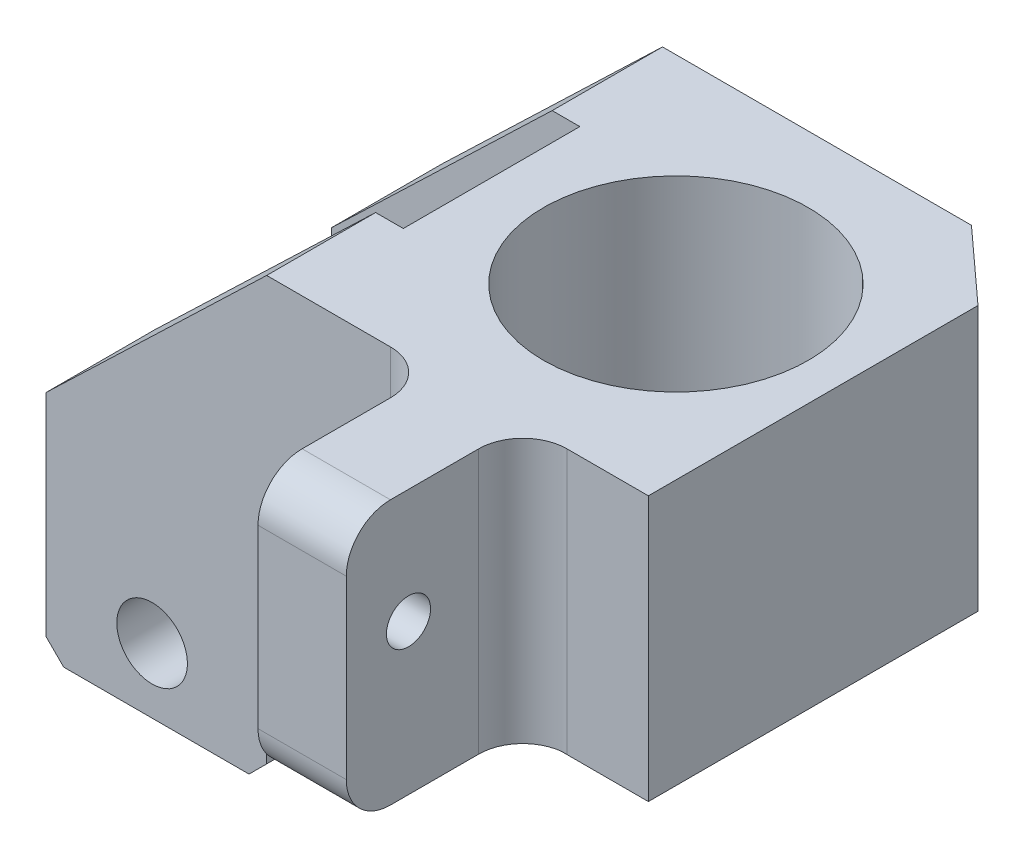
ISO-10303-21;
HEADER;
FILE_DESCRIPTION(('STEP AP214'),'2;1');
FILE_NAME('part.step','',(''),(''),'','','');
FILE_SCHEMA(('AUTOMOTIVE_DESIGN { 1 0 10303 214 1 1 1 1 }'));
ENDSEC;
DATA;
#1=APPLICATION_CONTEXT('core data for automotive mechanical design processes');
#2=APPLICATION_PROTOCOL_DEFINITION('international standard','automotive_design',2000,#1);
#3=PRODUCT_CONTEXT('',#1,'mechanical');
#4=PRODUCT('Part','Part','',(#3));
#5=PRODUCT_RELATED_PRODUCT_CATEGORY('part','',(#4));
#6=PRODUCT_DEFINITION_FORMATION('','',#4);
#7=PRODUCT_DEFINITION_CONTEXT('part definition',#1,'design');
#8=PRODUCT_DEFINITION('design','',#6,#7);
#9=PRODUCT_DEFINITION_SHAPE('','',#8);
#10=(LENGTH_UNIT() NAMED_UNIT(*) SI_UNIT(.MILLI.,.METRE.));
#11=(NAMED_UNIT(*) PLANE_ANGLE_UNIT() SI_UNIT($,.RADIAN.));
#12=(NAMED_UNIT(*) SI_UNIT($,.STERADIAN.) SOLID_ANGLE_UNIT());
#13=UNCERTAINTY_MEASURE_WITH_UNIT(LENGTH_MEASURE(1.E-05),#10,'distance_accuracy_value','');
#14=(GEOMETRIC_REPRESENTATION_CONTEXT(3) GLOBAL_UNCERTAINTY_ASSIGNED_CONTEXT((#13)) GLOBAL_UNIT_ASSIGNED_CONTEXT((#10,
#11,#12)) REPRESENTATION_CONTEXT('',''));
#15=CARTESIAN_POINT('',(0.,0.,0.));
#16=DIRECTION('',(0.,0.,1.));
#17=DIRECTION('',(1.,0.,0.));
#18=AXIS2_PLACEMENT_3D('',#15,#16,#17);
#19=CARTESIAN_POINT('',(-24.019063341913,30.,22.3427618367169));
#20=DIRECTION('',(0.,0.,-1.));
#21=DIRECTION('',(-1.,0.,0.));
#22=AXIS2_PLACEMENT_3D('',#19,#20,#21);
#23=PLANE('',#22);
#24=CARTESIAN_POINT('',(-37.0000000016137,-12.5783063820862,22.3427618367169));
#25=DIRECTION('',(0.,0.,-1.));
#26=DIRECTION('',(-1.,0.,0.));
#27=AXIS2_PLACEMENT_3D('',#24,#25,#26);
#28=CIRCLE('',#27,3.99999999676854);
#29=CARTESIAN_POINT('',(-40.9999999983823,-12.5783063820862,22.3427618367169));
#30=VERTEX_POINT('',#29);
#31=EDGE_CURVE('E233',#30,#30,#28,.T.);
#32=ORIENTED_EDGE('',*,*,#31,.T.);
#33=EDGE_LOOP('',(#32));
#34=FACE_BOUND('',#33,.T.);
#35=DIRECTION('',(1.,0.,0.));
#36=VECTOR('',#35,1.);
#37=CARTESIAN_POINT('',(5.,0.0426958795110487,22.3427618367169));
#38=LINE('',#37,#36);
#39=CARTESIAN_POINT('',(-10.,0.0426958795110487,22.3427618367169));
#40=VERTEX_POINT('',#39);
#41=CARTESIAN_POINT('',(10.,0.0426958795110487,22.3427618367169));
#42=VERTEX_POINT('',#41);
#43=EDGE_CURVE('E46',#40,#42,#38,.T.);
#44=ORIENTED_EDGE('',*,*,#43,.F.);
#45=DIRECTION('',(0.,-1.,0.));
#46=VECTOR('',#45,1.);
#47=CARTESIAN_POINT('',(-10.,30.,22.3427618367169));
#48=LINE('',#47,#46);
#49=CARTESIAN_POINT('',(-10.,30.,22.3427618367169));
#50=VERTEX_POINT('',#49);
#51=EDGE_CURVE('E474',#40,#50,#48,.F.);
#52=ORIENTED_EDGE('',*,*,#51,.T.);
#53=DIRECTION('',(1.,0.,0.));
#54=VECTOR('',#53,1.);
#55=CARTESIAN_POINT('',(-24.019063341913,30.,22.3427618367169));
#56=LINE('',#55,#54);
#57=CARTESIAN_POINT('',(-24.019063341913,30.,22.3427618367169));
#58=VERTEX_POINT('',#57);
#59=EDGE_CURVE('E336',#58,#50,#56,.T.);
#60=ORIENTED_EDGE('',*,*,#59,.F.);
#61=DIRECTION('',(0.721568425538812,0.692343128271986,0.));
#62=VECTOR('',#61,1.);
#63=CARTESIAN_POINT('',(-24.019063341913,30.,22.3427618367169));
#64=LINE('',#63,#62);
#65=CARTESIAN_POINT('',(-49.019063341913,6.01256153375207,22.3427618367169));
#66=VERTEX_POINT('',#65);
#67=EDGE_CURVE('E255',#66,#58,#64,.T.);
#68=ORIENTED_EDGE('',*,*,#67,.F.);
#69=DIRECTION('',(0.,1.,0.));
#70=VECTOR('',#69,1.);
#71=CARTESIAN_POINT('',(-49.019063341913,-19.9275306984768,22.3427618367169));
#72=LINE('',#71,#70);
#73=CARTESIAN_POINT('',(-49.019063341913,-17.9275306984768,22.3427618367169));
#74=VERTEX_POINT('',#73);
#75=EDGE_CURVE('E555',#74,#66,#72,.T.);
#76=ORIENTED_EDGE('',*,*,#75,.F.);
#77=DIRECTION('',(-0.707106781186545,0.70710678118655,0.));
#78=VECTOR('',#77,1.);
#79=CARTESIAN_POINT('',(-47.019063341913,-19.9275306984768,22.3427618367169));
#80=LINE('',#79,#78);
#81=CARTESIAN_POINT('',(-47.019063341913,-19.9275306984768,22.3427618367169));
#82=VERTEX_POINT('',#81);
#83=EDGE_CURVE('E419',#74,#82,#80,.F.);
#84=ORIENTED_EDGE('',*,*,#83,.T.);
#85=DIRECTION('',(-1.,0.,0.));
#86=VECTOR('',#85,1.);
#87=CARTESIAN_POINT('',(-49.019063341913,-19.9275306984768,22.3427618367169));
#88=LINE('',#87,#86);
#89=CARTESIAN_POINT('',(-26.019063341913,-19.9275306984768,22.3427618367169));
#90=VERTEX_POINT('',#89);
#91=EDGE_CURVE('E262',#90,#82,#88,.T.);
#92=ORIENTED_EDGE('',*,*,#91,.F.);
#93=DIRECTION('',(-0.70710678118655,-0.707106781186545,0.));
#94=VECTOR('',#93,1.);
#95=CARTESIAN_POINT('',(-24.019063341913,-17.9275306984768,22.3427618367169));
#96=LINE('',#95,#94);
#97=CARTESIAN_POINT('',(-24.019063341913,-17.9275306984768,22.3427618367169));
#98=VERTEX_POINT('',#97);
#99=EDGE_CURVE('E421',#90,#98,#96,.F.);
#100=ORIENTED_EDGE('',*,*,#99,.T.);
#101=DIRECTION('',(0.,-1.,0.));
#102=VECTOR('',#101,1.);
#103=CARTESIAN_POINT('',(-24.019063341913,-19.9275306984768,22.3427618367169));
#104=LINE('',#103,#102);
#105=CARTESIAN_POINT('',(-24.019063341913,-5.,22.3427618367169));
#106=VERTEX_POINT('',#105);
#107=EDGE_CURVE('E258',#106,#98,#104,.T.);
#108=ORIENTED_EDGE('',*,*,#107,.F.);
#109=CARTESIAN_POINT('',(-19.0190633419129,-5.,22.3427618367169));
#110=DIRECTION('',(0.,0.,-1.));
#111=DIRECTION('',(-1.,0.,0.));
#112=AXIS2_PLACEMENT_3D('',#109,#110,#111);
#113=CIRCLE('',#112,5.);
#114=CARTESIAN_POINT('',(-19.0190633419129,0.,22.3427618367169));
#115=VERTEX_POINT('',#114);
#116=EDGE_CURVE('E592',#106,#115,#113,.T.);
#117=ORIENTED_EDGE('',*,*,#116,.T.);
#118=DIRECTION('',(1.,0.,0.));
#119=VECTOR('',#118,1.);
#120=CARTESIAN_POINT('',(-24.019063341913,0.,22.3427618367169));
#121=LINE('',#120,#119);
#122=CARTESIAN_POINT('',(19.2234627300087,0.,22.3427618367169));
#123=VERTEX_POINT('',#122);
#124=EDGE_CURVE('E273',#115,#123,#121,.T.);
#125=ORIENTED_EDGE('',*,*,#124,.T.);
#126=DIRECTION('',(0.,-1.,0.));
#127=VECTOR('',#126,1.);
#128=CARTESIAN_POINT('',(19.2234627300087,30.,22.3427618367169));
#129=LINE('',#128,#127);
#130=CARTESIAN_POINT('',(19.2234627300087,30.,22.3427618367169));
#131=VERTEX_POINT('',#130);
#132=EDGE_CURVE('E340',#131,#123,#129,.T.);
#133=ORIENTED_EDGE('',*,*,#132,.F.);
#134=CARTESIAN_POINT('',(10.,30.,22.3427618367169));
#135=VERTEX_POINT('',#134);
#136=EDGE_CURVE('E327',#135,#131,#56,.T.);
#137=ORIENTED_EDGE('',*,*,#136,.F.);
#138=DIRECTION('',(0.,1.,0.));
#139=VECTOR('',#138,1.);
#140=CARTESIAN_POINT('',(10.,0.0426958795110488,22.3427618367169));
#141=LINE('',#140,#139);
#142=EDGE_CURVE('E468',#135,#42,#141,.F.);
#143=ORIENTED_EDGE('',*,*,#142,.T.);
#144=EDGE_LOOP('',(#44,#52,#60,#68,#76,#84,#92,#100,#108,#117,#125,#133,#137,#143));
#145=FACE_BOUND('',#144,.T.);
#146=ADVANCED_FACE('F31',(#34,#145),#23,.F.);
#147=CARTESIAN_POINT('',(-24.019063341913,30.,22.3427618367169));
#148=DIRECTION('',(-0.692343128271986,0.721568425538812,0.));
#149=DIRECTION('',(-0.721568425538812,-0.692343128271986,0.));
#150=AXIS2_PLACEMENT_3D('',#147,#148,#149);
#151=PLANE('',#150);
#152=DIRECTION('',(0.721568425538812,0.692343128271986,0.));
#153=VECTOR('',#152,1.);
#154=CARTESIAN_POINT('',(-24.019063341913,30.,10.));
#155=LINE('',#154,#153);
#156=CARTESIAN_POINT('',(-49.019063341913,6.01256153375207,10.));
#157=VERTEX_POINT('',#156);
#158=CARTESIAN_POINT('',(-24.019063341913,30.,10.));
#159=VERTEX_POINT('',#158);
#160=EDGE_CURVE('E252',#157,#159,#155,.T.);
#161=ORIENTED_EDGE('',*,*,#160,.F.);
#162=DIRECTION('',(0.,0.,-1.));
#163=VECTOR('',#162,1.);
#164=CARTESIAN_POINT('',(-49.019063341913,6.01256153375207,22.3427618367169));
#165=LINE('',#164,#163);
#166=EDGE_CURVE('E308',#66,#157,#165,.T.);
#167=ORIENTED_EDGE('',*,*,#166,.F.);
#168=ORIENTED_EDGE('',*,*,#67,.T.);
#169=DIRECTION('',(0.,0.,1.));
#170=VECTOR('',#169,1.);
#171=CARTESIAN_POINT('',(-24.019063341913,30.,-22.5));
#172=LINE('',#171,#170);
#173=EDGE_CURVE('E325',#159,#58,#172,.T.);
#174=ORIENTED_EDGE('',*,*,#173,.F.);
#175=EDGE_LOOP('',(#161,#167,#168,#174));
#176=FACE_BOUND('',#175,.T.);
#177=ADVANCED_FACE('F499',(#176),#151,.T.);
#178=CARTESIAN_POINT('',(-49.019063341913,-19.9275306984768,22.3427618367169));
#179=DIRECTION('',(-1.,0.,0.));
#180=DIRECTION('',(0.,0.,1.));
#181=AXIS2_PLACEMENT_3D('',#178,#179,#180);
#182=PLANE('',#181);
#183=DIRECTION('',(0.,1.,0.));
#184=VECTOR('',#183,1.);
#185=CARTESIAN_POINT('',(-49.019063341913,-19.9275306984768,10.));
#186=LINE('',#185,#184);
#187=CARTESIAN_POINT('',(-49.019063341913,-17.9275306984768,10.));
#188=VERTEX_POINT('',#187);
#189=EDGE_CURVE('E245',#188,#157,#186,.T.);
#190=ORIENTED_EDGE('',*,*,#189,.F.);
#191=DIRECTION('',(0.,0.,1.));
#192=VECTOR('',#191,1.);
#193=CARTESIAN_POINT('',(-49.019063341913,-17.9275306984768,22.3427618367169));
#194=LINE('',#193,#192);
#195=EDGE_CURVE('E341',#188,#74,#194,.T.);
#196=ORIENTED_EDGE('',*,*,#195,.T.);
#197=ORIENTED_EDGE('',*,*,#75,.T.);
#198=ORIENTED_EDGE('',*,*,#166,.T.);
#199=EDGE_LOOP('',(#190,#196,#197,#198));
#200=FACE_BOUND('',#199,.T.);
#201=ADVANCED_FACE('F505',(#200),#182,.T.);
#202=CARTESIAN_POINT('',(-49.019063341913,-19.9275306984768,22.3427618367169));
#203=DIRECTION('',(0.,-1.,0.));
#204=DIRECTION('',(0.,0.,-1.));
#205=AXIS2_PLACEMENT_3D('',#202,#203,#204);
#206=PLANE('',#205);
#207=DIRECTION('',(-1.,0.,0.));
#208=VECTOR('',#207,1.);
#209=CARTESIAN_POINT('',(-49.019063341913,-19.9275306984768,10.));
#210=LINE('',#209,#208);
#211=CARTESIAN_POINT('',(-26.019063341913,-19.9275306984768,10.));
#212=VERTEX_POINT('',#211);
#213=CARTESIAN_POINT('',(-47.019063341913,-19.9275306984768,10.));
#214=VERTEX_POINT('',#213);
#215=EDGE_CURVE('E241',#212,#214,#210,.T.);
#216=ORIENTED_EDGE('',*,*,#215,.F.);
#217=DIRECTION('',(0.,0.,1.));
#218=VECTOR('',#217,1.);
#219=CARTESIAN_POINT('',(-26.019063341913,-19.9275306984768,22.3427618367169));
#220=LINE('',#219,#218);
#221=EDGE_CURVE('E417',#212,#90,#220,.T.);
#222=ORIENTED_EDGE('',*,*,#221,.T.);
#223=ORIENTED_EDGE('',*,*,#91,.T.);
#224=DIRECTION('',(0.,0.,-1.));
#225=VECTOR('',#224,1.);
#226=CARTESIAN_POINT('',(-47.019063341913,-19.9275306984768,22.3427618367169));
#227=LINE('',#226,#225);
#228=EDGE_CURVE('E414',#82,#214,#227,.T.);
#229=ORIENTED_EDGE('',*,*,#228,.T.);
#230=EDGE_LOOP('',(#216,#222,#223,#229));
#231=FACE_BOUND('',#230,.T.);
#232=ADVANCED_FACE('F558',(#231),#206,.T.);
#233=CARTESIAN_POINT('',(-24.019063341913,-19.9275306984768,22.3427618367169));
#234=DIRECTION('',(1.,0.,0.));
#235=DIRECTION('',(0.,0.,-1.));
#236=AXIS2_PLACEMENT_3D('',#233,#234,#235);
#237=PLANE('',#236);
#238=ORIENTED_EDGE('',*,*,#107,.T.);
#239=DIRECTION('',(0.,0.,-1.));
#240=VECTOR('',#239,1.);
#241=CARTESIAN_POINT('',(-24.019063341913,-17.9275306984768,22.3427618367169));
#242=LINE('',#241,#240);
#243=CARTESIAN_POINT('',(-24.019063341913,-17.9275306984768,10.));
#244=VERTEX_POINT('',#243);
#245=EDGE_CURVE('E403',#98,#244,#242,.T.);
#246=ORIENTED_EDGE('',*,*,#245,.T.);
#247=DIRECTION('',(0.,-1.,0.));
#248=VECTOR('',#247,1.);
#249=CARTESIAN_POINT('',(-24.019063341913,-19.9275306984768,10.));
#250=LINE('',#249,#248);
#251=CARTESIAN_POINT('',(-24.019063341913,-5.,10.));
#252=VERTEX_POINT('',#251);
#253=EDGE_CURVE('E291',#252,#244,#250,.T.);
#254=ORIENTED_EDGE('',*,*,#253,.F.);
#255=DIRECTION('',(0.,0.,1.));
#256=VECTOR('',#255,1.);
#257=CARTESIAN_POINT('',(-24.019063341913,-5.,16.1713809183584));
#258=LINE('',#257,#256);
#259=EDGE_CURVE('E270',#252,#106,#258,.T.);
#260=ORIENTED_EDGE('',*,*,#259,.T.);
#261=EDGE_LOOP('',(#238,#246,#254,#260));
#262=FACE_BOUND('',#261,.T.);
#263=ADVANCED_FACE('F524',(#262),#237,.T.);
#264=CARTESIAN_POINT('',(19.2234627300087,30.,-14.9999999997707));
#265=DIRECTION('',(-1.,0.,0.));
#266=DIRECTION('',(0.,0.,1.));
#267=AXIS2_PLACEMENT_3D('',#264,#265,#266);
#268=PLANE('',#267);
#269=DIRECTION('',(0.,0.,-1.));
#270=VECTOR('',#269,1.);
#271=CARTESIAN_POINT('',(19.2234627300087,0.,-14.9999999997707));
#272=LINE('',#271,#270);
#273=CARTESIAN_POINT('',(19.2234627300087,0.,-14.9999999997707));
#274=VERTEX_POINT('',#273);
#275=EDGE_CURVE('E316',#123,#274,#272,.T.);
#276=ORIENTED_EDGE('',*,*,#275,.T.);
#277=DIRECTION('',(0.,-1.,0.));
#278=VECTOR('',#277,1.);
#279=CARTESIAN_POINT('',(19.2234627300087,30.,-14.9999999997707));
#280=LINE('',#279,#278);
#281=CARTESIAN_POINT('',(19.2234627300087,30.,-14.9999999997707));
#282=VERTEX_POINT('',#281);
#283=EDGE_CURVE('E282',#282,#274,#280,.T.);
#284=ORIENTED_EDGE('',*,*,#283,.F.);
#285=DIRECTION('',(0.,0.,-1.));
#286=VECTOR('',#285,1.);
#287=CARTESIAN_POINT('',(19.2234627300087,30.,-14.9999999997707));
#288=LINE('',#287,#286);
#289=EDGE_CURVE('E276',#131,#282,#288,.T.);
#290=ORIENTED_EDGE('',*,*,#289,.F.);
#291=ORIENTED_EDGE('',*,*,#132,.T.);
#292=EDGE_LOOP('',(#276,#284,#290,#291));
#293=FACE_BOUND('',#292,.T.);
#294=ADVANCED_FACE('F520',(#293),#268,.F.);
#295=CARTESIAN_POINT('',(10.9809366580871,30.,-22.5));
#296=DIRECTION('',(-0.673006541707205,0.,0.739636528856782));
#297=DIRECTION('',(0.739636528856782,0.,0.673006541707205));
#298=AXIS2_PLACEMENT_3D('',#295,#296,#297);
#299=PLANE('',#298);
#300=DIRECTION('',(-0.739636528856782,0.,-0.673006541707205));
#301=VECTOR('',#300,1.);
#302=CARTESIAN_POINT('',(10.9809366580871,0.,-22.5));
#303=LINE('',#302,#301);
#304=CARTESIAN_POINT('',(10.9809366580871,0.,-22.5));
#305=VERTEX_POINT('',#304);
#306=EDGE_CURVE('E286',#274,#305,#303,.T.);
#307=ORIENTED_EDGE('',*,*,#306,.T.);
#308=DIRECTION('',(0.,-1.,0.));
#309=VECTOR('',#308,1.);
#310=CARTESIAN_POINT('',(10.9809366580871,30.,-22.5));
#311=LINE('',#310,#309);
#312=CARTESIAN_POINT('',(10.9809366580871,30.,-22.5));
#313=VERTEX_POINT('',#312);
#314=EDGE_CURVE('E872',#313,#305,#311,.T.);
#315=ORIENTED_EDGE('',*,*,#314,.F.);
#316=DIRECTION('',(-0.739636528856782,0.,-0.673006541707205));
#317=VECTOR('',#316,1.);
#318=CARTESIAN_POINT('',(10.9809366580871,30.,-22.5));
#319=LINE('',#318,#317);
#320=EDGE_CURVE('E321',#282,#313,#319,.T.);
#321=ORIENTED_EDGE('',*,*,#320,.F.);
#322=ORIENTED_EDGE('',*,*,#283,.T.);
#323=EDGE_LOOP('',(#307,#315,#321,#322));
#324=FACE_BOUND('',#323,.T.);
#325=ADVANCED_FACE('F516',(#324),#299,.F.);
#326=CARTESIAN_POINT('',(-24.019063341913,30.,-22.5));
#327=DIRECTION('',(0.,0.,1.));
#328=DIRECTION('',(1.,0.,0.));
#329=AXIS2_PLACEMENT_3D('',#326,#327,#328);
#330=PLANE('',#329);
#331=CARTESIAN_POINT('',(-37.0000000016137,-12.5783063820862,-22.5));
#332=DIRECTION('',(0.,0.,-1.));
#333=DIRECTION('',(-1.,0.,0.));
#334=AXIS2_PLACEMENT_3D('',#331,#332,#333);
#335=CIRCLE('',#334,3.99999999676854);
#336=CARTESIAN_POINT('',(-40.9999999983823,-12.5783063820862,-22.5));
#337=VERTEX_POINT('',#336);
#338=EDGE_CURVE('E297',#337,#337,#335,.T.);
#339=ORIENTED_EDGE('',*,*,#338,.F.);
#340=EDGE_LOOP('',(#339));
#341=FACE_BOUND('',#340,.T.);
#342=DIRECTION('',(0.,-1.,0.));
#343=VECTOR('',#342,1.);
#344=CARTESIAN_POINT('',(-24.019063341913,-19.9275306984768,-22.5));
#345=LINE('',#344,#343);
#346=CARTESIAN_POINT('',(-24.019063341913,-5.,-22.5));
#347=VERTEX_POINT('',#346);
#348=CARTESIAN_POINT('',(-24.019063341913,-17.9275306984768,-22.5));
#349=VERTEX_POINT('',#348);
#350=EDGE_CURVE('E298',#347,#349,#345,.T.);
#351=ORIENTED_EDGE('',*,*,#350,.T.);
#352=DIRECTION('',(0.70710678118655,0.707106781186545,0.));
#353=VECTOR('',#352,1.);
#354=CARTESIAN_POINT('',(-24.019063341913,-17.9275306984768,-22.5));
#355=LINE('',#354,#353);
#356=CARTESIAN_POINT('',(-26.019063341913,-19.9275306984768,-22.5));
#357=VERTEX_POINT('',#356);
#358=EDGE_CURVE('E570',#349,#357,#355,.F.);
#359=ORIENTED_EDGE('',*,*,#358,.T.);
#360=DIRECTION('',(-1.,0.,0.));
#361=VECTOR('',#360,1.);
#362=CARTESIAN_POINT('',(-49.019063341913,-19.9275306984768,-22.5));
#363=LINE('',#362,#361);
#364=CARTESIAN_POINT('',(-47.019063341913,-19.9275306984768,-22.5));
#365=VERTEX_POINT('',#364);
#366=EDGE_CURVE('E301',#357,#365,#363,.T.);
#367=ORIENTED_EDGE('',*,*,#366,.T.);
#368=DIRECTION('',(0.707106781186545,-0.70710678118655,0.));
#369=VECTOR('',#368,1.);
#370=CARTESIAN_POINT('',(-47.019063341913,-19.9275306984768,-22.5));
#371=LINE('',#370,#369);
#372=CARTESIAN_POINT('',(-49.019063341913,-17.9275306984768,-22.5));
#373=VERTEX_POINT('',#372);
#374=EDGE_CURVE('E568',#365,#373,#371,.F.);
#375=ORIENTED_EDGE('',*,*,#374,.T.);
#376=DIRECTION('',(0.,1.,0.));
#377=VECTOR('',#376,1.);
#378=CARTESIAN_POINT('',(-49.019063341913,-19.9275306984768,-22.5));
#379=LINE('',#378,#377);
#380=CARTESIAN_POINT('',(-49.019063341913,6.01256153375207,-22.5));
#381=VERTEX_POINT('',#380);
#382=EDGE_CURVE('E259',#373,#381,#379,.T.);
#383=ORIENTED_EDGE('',*,*,#382,.T.);
#384=DIRECTION('',(0.721568425538812,0.692343128271986,0.));
#385=VECTOR('',#384,1.);
#386=CARTESIAN_POINT('',(-24.019063341913,30.,-22.5));
#387=LINE('',#386,#385);
#388=CARTESIAN_POINT('',(-24.019063341913,30.,-22.5));
#389=VERTEX_POINT('',#388);
#390=EDGE_CURVE('E222',#381,#389,#387,.T.);
#391=ORIENTED_EDGE('',*,*,#390,.T.);
#392=DIRECTION('',(-1.,0.,0.));
#393=VECTOR('',#392,1.);
#394=CARTESIAN_POINT('',(-24.019063341913,30.,-22.5));
#395=LINE('',#394,#393);
#396=EDGE_CURVE('E323',#313,#389,#395,.T.);
#397=ORIENTED_EDGE('',*,*,#396,.F.);
#398=ORIENTED_EDGE('',*,*,#314,.T.);
#399=DIRECTION('',(-1.,0.,0.));
#400=VECTOR('',#399,1.);
#401=CARTESIAN_POINT('',(-24.019063341913,0.,-22.5));
#402=LINE('',#401,#400);
#403=CARTESIAN_POINT('',(-19.0190633419129,0.,-22.5));
#404=VERTEX_POINT('',#403);
#405=EDGE_CURVE('E277',#305,#404,#402,.T.);
#406=ORIENTED_EDGE('',*,*,#405,.T.);
#407=CARTESIAN_POINT('',(-19.0190633419129,-5.,-22.5));
#408=DIRECTION('',(0.,0.,1.));
#409=DIRECTION('',(1.,0.,0.));
#410=AXIS2_PLACEMENT_3D('',#407,#408,#409);
#411=CIRCLE('',#410,5.);
#412=EDGE_CURVE('E575',#404,#347,#411,.T.);
#413=ORIENTED_EDGE('',*,*,#412,.T.);
#414=EDGE_LOOP('',(#351,#359,#367,#375,#383,#391,#397,#398,#406,#413));
#415=FACE_BOUND('',#414,.T.);
#416=ADVANCED_FACE('F513',(#341,#415),#330,.F.);
#417=CARTESIAN_POINT('',(19.2234627300087,30.,22.3427618367169));
#418=DIRECTION('',(0.,1.,0.));
#419=DIRECTION('',(0.,0.,1.));
#420=AXIS2_PLACEMENT_3D('',#417,#418,#419);
#421=PLANE('',#420);
#422=DIRECTION('',(0.,0.,-1.));
#423=VECTOR('',#422,1.);
#424=CARTESIAN_POINT('',(-5.,30.,42.3427618367169));
#425=LINE('',#424,#423);
#426=CARTESIAN_POINT('',(-5.,30.,37.3427618367169));
#427=VERTEX_POINT('',#426);
#428=CARTESIAN_POINT('',(-5.,30.,27.3427618367169));
#429=VERTEX_POINT('',#428);
#430=EDGE_CURVE('E348',#427,#429,#425,.T.);
#431=ORIENTED_EDGE('',*,*,#430,.F.);
#432=DIRECTION('',(-1.,0.,0.));
#433=VECTOR('',#432,1.);
#434=CARTESIAN_POINT('',(19.2234627300087,30.,37.3427618367169));
#435=LINE('',#434,#433);
#436=CARTESIAN_POINT('',(5.,30.,37.3427618367169));
#437=VERTEX_POINT('',#436);
#438=EDGE_CURVE('E361',#427,#437,#435,.F.);
#439=ORIENTED_EDGE('',*,*,#438,.T.);
#440=DIRECTION('',(0.,0.,-1.));
#441=VECTOR('',#440,1.);
#442=CARTESIAN_POINT('',(5.,30.,42.3427618367169));
#443=LINE('',#442,#441);
#444=CARTESIAN_POINT('',(5.,30.,27.3427618367169));
#445=VERTEX_POINT('',#444);
#446=EDGE_CURVE('E352',#437,#445,#443,.T.);
#447=ORIENTED_EDGE('',*,*,#446,.T.);
#448=CARTESIAN_POINT('',(10.,30.,27.3427618367169));
#449=DIRECTION('',(0.,1.,0.));
#450=DIRECTION('',(0.,0.,1.));
#451=AXIS2_PLACEMENT_3D('',#448,#449,#450);
#452=CIRCLE('',#451,5.);
#453=EDGE_CURVE('E39',#445,#135,#452,.F.);
#454=ORIENTED_EDGE('',*,*,#453,.T.);
#455=ORIENTED_EDGE('',*,*,#136,.T.);
#456=ORIENTED_EDGE('',*,*,#289,.T.);
#457=ORIENTED_EDGE('',*,*,#320,.T.);
#458=ORIENTED_EDGE('',*,*,#396,.T.);
#459=CARTESIAN_POINT('',(-24.019063341913,30.,-10.));
#460=VERTEX_POINT('',#459);
#461=EDGE_CURVE('E240',#389,#460,#172,.T.);
#462=ORIENTED_EDGE('',*,*,#461,.T.);
#463=DIRECTION('',(-1.,0.,0.));
#464=VECTOR('',#463,1.);
#465=CARTESIAN_POINT('',(19.2234627300087,30.,-10.));
#466=LINE('',#465,#464);
#467=CARTESIAN_POINT('',(-20.8824295978616,30.,-10.));
#468=VERTEX_POINT('',#467);
#469=EDGE_CURVE('E228',#468,#460,#466,.T.);
#470=ORIENTED_EDGE('',*,*,#469,.F.);
#471=DIRECTION('',(0.,0.,-1.));
#472=VECTOR('',#471,1.);
#473=CARTESIAN_POINT('',(-20.8824295978616,30.,22.3427618367169));
#474=LINE('',#473,#472);
#475=CARTESIAN_POINT('',(-20.8824295978616,30.,10.));
#476=VERTEX_POINT('',#475);
#477=EDGE_CURVE('E212',#476,#468,#474,.T.);
#478=ORIENTED_EDGE('',*,*,#477,.F.);
#479=DIRECTION('',(1.,0.,0.));
#480=VECTOR('',#479,1.);
#481=CARTESIAN_POINT('',(19.2234627300087,30.,10.));
#482=LINE('',#481,#480);
#483=EDGE_CURVE('E223',#159,#476,#482,.T.);
#484=ORIENTED_EDGE('',*,*,#483,.F.);
#485=ORIENTED_EDGE('',*,*,#173,.T.);
#486=ORIENTED_EDGE('',*,*,#59,.T.);
#487=CARTESIAN_POINT('',(-10.,30.,27.3427618367169));
#488=DIRECTION('',(0.,1.,0.));
#489=DIRECTION('',(0.,0.,1.));
#490=AXIS2_PLACEMENT_3D('',#487,#488,#489);
#491=CIRCLE('',#490,5.);
#492=EDGE_CURVE('E478',#50,#429,#491,.F.);
#493=ORIENTED_EDGE('',*,*,#492,.T.);
#494=EDGE_LOOP('',(#431,#439,#447,#454,#455,#456,#457,#458,#462,#470,#478,#484,#485,#486,#493));
#495=FACE_BOUND('',#494,.T.);
#496=CARTESIAN_POINT('',(0.,30.,0.));
#497=DIRECTION('',(0.,1.,0.));
#498=DIRECTION('',(0.,0.,1.));
#499=AXIS2_PLACEMENT_3D('',#496,#497,#498);
#500=CIRCLE('',#499,15.);
#501=CARTESIAN_POINT('',(0.,30.,15.));
#502=VERTEX_POINT('',#501);
#503=EDGE_CURVE('E311',#502,#502,#500,.T.);
#504=ORIENTED_EDGE('',*,*,#503,.F.);
#505=EDGE_LOOP('',(#504));
#506=FACE_BOUND('',#505,.T.);
#507=ADVANCED_FACE('F237',(#495,#506),#421,.T.);
#508=CARTESIAN_POINT('',(19.2234627300087,0.,22.3427618367169));
#509=DIRECTION('',(0.,1.,0.));
#510=DIRECTION('',(0.,0.,1.));
#511=AXIS2_PLACEMENT_3D('',#508,#509,#510);
#512=PLANE('',#511);
#513=CARTESIAN_POINT('',(0.,0.,0.));
#514=DIRECTION('',(0.,1.,0.));
#515=DIRECTION('',(0.,0.,1.));
#516=AXIS2_PLACEMENT_3D('',#513,#514,#515);
#517=CIRCLE('',#516,15.);
#518=CARTESIAN_POINT('',(0.,0.,15.));
#519=VERTEX_POINT('',#518);
#520=EDGE_CURVE('E313',#519,#519,#517,.T.);
#521=ORIENTED_EDGE('',*,*,#520,.T.);
#522=EDGE_LOOP('',(#521));
#523=FACE_BOUND('',#522,.T.);
#524=ORIENTED_EDGE('',*,*,#124,.F.);
#525=DIRECTION('',(0.,0.,1.));
#526=VECTOR('',#525,1.);
#527=CARTESIAN_POINT('',(-19.0190633419129,0.,22.3427618367169));
#528=LINE('',#527,#526);
#529=EDGE_CURVE('E272',#115,#404,#528,.F.);
#530=ORIENTED_EDGE('',*,*,#529,.T.);
#531=ORIENTED_EDGE('',*,*,#405,.F.);
#532=ORIENTED_EDGE('',*,*,#306,.F.);
#533=ORIENTED_EDGE('',*,*,#275,.F.);
#534=EDGE_LOOP('',(#524,#530,#531,#532,#533));
#535=FACE_BOUND('',#534,.T.);
#536=ADVANCED_FACE('F511',(#523,#535),#512,.F.);
#537=CARTESIAN_POINT('',(0.,0.,0.));
#538=DIRECTION('',(0.,1.,0.));
#539=DIRECTION('',(0.,0.,1.));
#540=AXIS2_PLACEMENT_3D('',#537,#538,#539);
#541=CYLINDRICAL_SURFACE('',#540,15.);
#542=ORIENTED_EDGE('',*,*,#520,.F.);
#543=EDGE_LOOP('',(#542));
#544=FACE_BOUND('',#543,.T.);
#545=ORIENTED_EDGE('',*,*,#503,.T.);
#546=EDGE_LOOP('',(#545));
#547=FACE_BOUND('',#546,.T.);
#548=ADVANCED_FACE('F628',(#544,#547),#541,.F.);
#549=DIRECTION('',(-0.721568425538812,-0.692343128271986,0.));
#550=VECTOR('',#549,1.);
#551=CARTESIAN_POINT('',(-24.019063341913,30.,-10.));
#552=LINE('',#551,#550);
#553=CARTESIAN_POINT('',(-49.019063341913,6.01256153375207,-10.));
#554=VERTEX_POINT('',#553);
#555=EDGE_CURVE('E242',#460,#554,#552,.T.);
#556=ORIENTED_EDGE('',*,*,#555,.F.);
#557=ORIENTED_EDGE('',*,*,#461,.F.);
#558=ORIENTED_EDGE('',*,*,#390,.F.);
#559=EDGE_CURVE('E312',#554,#381,#165,.T.);
#560=ORIENTED_EDGE('',*,*,#559,.F.);
#561=EDGE_LOOP('',(#556,#557,#558,#560));
#562=FACE_BOUND('',#561,.T.);
#563=ADVANCED_FACE('F508',(#562),#151,.T.);
#564=ORIENTED_EDGE('',*,*,#382,.F.);
#565=DIRECTION('',(0.,0.,1.));
#566=VECTOR('',#565,1.);
#567=CARTESIAN_POINT('',(-49.019063341913,-17.9275306984768,22.3427618367169));
#568=LINE('',#567,#566);
#569=CARTESIAN_POINT('',(-49.019063341913,-17.9275306984768,-10.));
#570=VERTEX_POINT('',#569);
#571=EDGE_CURVE('E397',#373,#570,#568,.T.);
#572=ORIENTED_EDGE('',*,*,#571,.T.);
#573=DIRECTION('',(0.,-1.,0.));
#574=VECTOR('',#573,1.);
#575=CARTESIAN_POINT('',(-49.019063341913,-19.9275306984768,-10.));
#576=LINE('',#575,#574);
#577=EDGE_CURVE('E247',#554,#570,#576,.T.);
#578=ORIENTED_EDGE('',*,*,#577,.F.);
#579=ORIENTED_EDGE('',*,*,#559,.T.);
#580=EDGE_LOOP('',(#564,#572,#578,#579));
#581=FACE_BOUND('',#580,.T.);
#582=ADVANCED_FACE('F562',(#581),#182,.T.);
#583=ORIENTED_EDGE('',*,*,#366,.F.);
#584=DIRECTION('',(0.,0.,1.));
#585=VECTOR('',#584,1.);
#586=CARTESIAN_POINT('',(-26.019063341913,-19.9275306984768,22.3427618367169));
#587=LINE('',#586,#585);
#588=CARTESIAN_POINT('',(-26.019063341913,-19.9275306984768,-10.));
#589=VERTEX_POINT('',#588);
#590=EDGE_CURVE('E401',#357,#589,#587,.T.);
#591=ORIENTED_EDGE('',*,*,#590,.T.);
#592=DIRECTION('',(1.,0.,0.));
#593=VECTOR('',#592,1.);
#594=CARTESIAN_POINT('',(-49.019063341913,-19.9275306984768,-10.));
#595=LINE('',#594,#593);
#596=CARTESIAN_POINT('',(-47.019063341913,-19.9275306984768,-10.));
#597=VERTEX_POINT('',#596);
#598=EDGE_CURVE('E383',#597,#589,#595,.T.);
#599=ORIENTED_EDGE('',*,*,#598,.F.);
#600=DIRECTION('',(0.,0.,-1.));
#601=VECTOR('',#600,1.);
#602=CARTESIAN_POINT('',(-47.019063341913,-19.9275306984768,22.3427618367169));
#603=LINE('',#602,#601);
#604=EDGE_CURVE('E399',#597,#365,#603,.T.);
#605=ORIENTED_EDGE('',*,*,#604,.T.);
#606=EDGE_LOOP('',(#583,#591,#599,#605));
#607=FACE_BOUND('',#606,.T.);
#608=ADVANCED_FACE('F579',(#607),#206,.T.);
#609=DIRECTION('',(0.,1.,0.));
#610=VECTOR('',#609,1.);
#611=CARTESIAN_POINT('',(-24.019063341913,-19.9275306984768,-10.));
#612=LINE('',#611,#610);
#613=CARTESIAN_POINT('',(-24.019063341913,-17.9275306984768,-10.));
#614=VERTEX_POINT('',#613);
#615=CARTESIAN_POINT('',(-24.019063341913,-5.,-10.));
#616=VERTEX_POINT('',#615);
#617=EDGE_CURVE('E289',#614,#616,#612,.T.);
#618=ORIENTED_EDGE('',*,*,#617,.F.);
#619=DIRECTION('',(0.,0.,-1.));
#620=VECTOR('',#619,1.);
#621=CARTESIAN_POINT('',(-24.019063341913,-17.9275306984768,22.3427618367169));
#622=LINE('',#621,#620);
#623=EDGE_CURVE('E571',#614,#349,#622,.T.);
#624=ORIENTED_EDGE('',*,*,#623,.T.);
#625=ORIENTED_EDGE('',*,*,#350,.F.);
#626=DIRECTION('',(0.,0.,1.));
#627=VECTOR('',#626,1.);
#628=CARTESIAN_POINT('',(-24.019063341913,-5.,22.3427618367169));
#629=LINE('',#628,#627);
#630=EDGE_CURVE('E268',#347,#616,#629,.T.);
#631=ORIENTED_EDGE('',*,*,#630,.T.);
#632=EDGE_LOOP('',(#618,#624,#625,#631));
#633=FACE_BOUND('',#632,.T.);
#634=ADVANCED_FACE('F586',(#633),#237,.T.);
#635=CARTESIAN_POINT('',(-20.8824295978616,-30.,-10.));
#636=DIRECTION('',(1.,0.,0.));
#637=DIRECTION('',(0.,0.,-1.));
#638=AXIS2_PLACEMENT_3D('',#635,#636,#637);
#639=PLANE('',#638);
#640=ORIENTED_EDGE('',*,*,#477,.T.);
#641=DIRECTION('',(0.,1.,0.));
#642=VECTOR('',#641,1.);
#643=CARTESIAN_POINT('',(-20.8824295978616,-30.,-10.));
#644=LINE('',#643,#642);
#645=CARTESIAN_POINT('',(-20.8824295978616,-0.360186836068505,-10.));
#646=VERTEX_POINT('',#645);
#647=EDGE_CURVE('E216',#646,#468,#644,.T.);
#648=ORIENTED_EDGE('',*,*,#647,.F.);
#649=DIRECTION('',(0.,0.,1.));
#650=VECTOR('',#649,1.);
#651=CARTESIAN_POINT('',(-20.8824295978616,-0.360186836068504,-10.));
#652=LINE('',#651,#650);
#653=CARTESIAN_POINT('',(-20.8824295978616,-0.360186836068505,10.));
#654=VERTEX_POINT('',#653);
#655=EDGE_CURVE('E597',#646,#654,#652,.T.);
#656=ORIENTED_EDGE('',*,*,#655,.T.);
#657=DIRECTION('',(0.,1.,0.));
#658=VECTOR('',#657,1.);
#659=CARTESIAN_POINT('',(-20.8824295978616,-30.,10.));
#660=LINE('',#659,#658);
#661=EDGE_CURVE('E218',#654,#476,#660,.T.);
#662=ORIENTED_EDGE('',*,*,#661,.T.);
#663=EDGE_LOOP('',(#640,#648,#656,#662));
#664=FACE_BOUND('',#663,.T.);
#665=ADVANCED_FACE('F214',(#664),#639,.F.);
#666=CARTESIAN_POINT('',(-65.5391185987355,-30.,10.));
#667=DIRECTION('',(0.,0.,1.));
#668=DIRECTION('',(1.,0.,0.));
#669=AXIS2_PLACEMENT_3D('',#666,#667,#668);
#670=PLANE('',#669);
#671=CARTESIAN_POINT('',(-37.0000000016137,-12.5783063820862,10.));
#672=DIRECTION('',(0.,0.,1.));
#673=DIRECTION('',(1.,0.,0.));
#674=AXIS2_PLACEMENT_3D('',#671,#672,#673);
#675=CIRCLE('',#674,3.99999999676854);
#676=CARTESIAN_POINT('',(-33.0000000048452,-12.5783063820862,10.));
#677=VERTEX_POINT('',#676);
#678=EDGE_CURVE('E296',#677,#677,#675,.T.);
#679=ORIENTED_EDGE('',*,*,#678,.T.);
#680=EDGE_LOOP('',(#679));
#681=FACE_BOUND('',#680,.T.);
#682=ORIENTED_EDGE('',*,*,#253,.T.);
#683=DIRECTION('',(0.70710678118655,0.707106781186545,0.));
#684=VECTOR('',#683,1.);
#685=CARTESIAN_POINT('',(-24.019063341913,-17.9275306984768,10.));
#686=LINE('',#685,#684);
#687=EDGE_CURVE('E412',#244,#212,#686,.F.);
#688=ORIENTED_EDGE('',*,*,#687,.T.);
#689=ORIENTED_EDGE('',*,*,#215,.T.);
#690=DIRECTION('',(0.707106781186545,-0.70710678118655,0.));
#691=VECTOR('',#690,1.);
#692=CARTESIAN_POINT('',(-47.019063341913,-19.9275306984768,10.));
#693=LINE('',#692,#691);
#694=EDGE_CURVE('E410',#214,#188,#693,.F.);
#695=ORIENTED_EDGE('',*,*,#694,.T.);
#696=ORIENTED_EDGE('',*,*,#189,.T.);
#697=ORIENTED_EDGE('',*,*,#160,.T.);
#698=ORIENTED_EDGE('',*,*,#483,.T.);
#699=ORIENTED_EDGE('',*,*,#661,.F.);
#700=CARTESIAN_POINT('',(-19.0190633419129,-5.,10.));
#701=DIRECTION('',(0.,0.,1.));
#702=DIRECTION('',(1.,0.,0.));
#703=AXIS2_PLACEMENT_3D('',#700,#701,#702);
#704=CIRCLE('',#703,5.);
#705=EDGE_CURVE('E593',#654,#252,#704,.T.);
#706=ORIENTED_EDGE('',*,*,#705,.T.);
#707=EDGE_LOOP('',(#682,#688,#689,#695,#696,#697,#698,#699,#706));
#708=FACE_BOUND('',#707,.T.);
#709=ADVANCED_FACE('F609',(#681,#708),#670,.F.);
#710=CARTESIAN_POINT('',(-65.5391185987355,-30.,-10.));
#711=DIRECTION('',(0.,0.,-1.));
#712=DIRECTION('',(-1.,0.,0.));
#713=AXIS2_PLACEMENT_3D('',#710,#711,#712);
#714=PLANE('',#713);
#715=CARTESIAN_POINT('',(-37.0000000016137,-12.5783063820862,-10.));
#716=DIRECTION('',(0.,0.,-1.));
#717=DIRECTION('',(-1.,0.,0.));
#718=AXIS2_PLACEMENT_3D('',#715,#716,#717);
#719=CIRCLE('',#718,3.99999999676854);
#720=CARTESIAN_POINT('',(-40.9999999983823,-12.5783063820862,-10.));
#721=VERTEX_POINT('',#720);
#722=EDGE_CURVE('E294',#721,#721,#719,.T.);
#723=ORIENTED_EDGE('',*,*,#722,.T.);
#724=EDGE_LOOP('',(#723));
#725=FACE_BOUND('',#724,.T.);
#726=ORIENTED_EDGE('',*,*,#598,.T.);
#727=DIRECTION('',(-0.70710678118655,-0.707106781186545,0.));
#728=VECTOR('',#727,1.);
#729=CARTESIAN_POINT('',(-24.019063341913,-17.9275306984768,-10.));
#730=LINE('',#729,#728);
#731=EDGE_CURVE('E400',#589,#614,#730,.F.);
#732=ORIENTED_EDGE('',*,*,#731,.T.);
#733=ORIENTED_EDGE('',*,*,#617,.T.);
#734=CARTESIAN_POINT('',(-19.0190633419129,-5.,-10.));
#735=DIRECTION('',(0.,0.,-1.));
#736=DIRECTION('',(-1.,0.,0.));
#737=AXIS2_PLACEMENT_3D('',#734,#735,#736);
#738=CIRCLE('',#737,5.);
#739=EDGE_CURVE('E231',#616,#646,#738,.T.);
#740=ORIENTED_EDGE('',*,*,#739,.T.);
#741=ORIENTED_EDGE('',*,*,#647,.T.);
#742=ORIENTED_EDGE('',*,*,#469,.T.);
#743=ORIENTED_EDGE('',*,*,#555,.T.);
#744=ORIENTED_EDGE('',*,*,#577,.T.);
#745=DIRECTION('',(-0.707106781186545,0.70710678118655,0.));
#746=VECTOR('',#745,1.);
#747=CARTESIAN_POINT('',(-47.019063341913,-19.9275306984768,-10.));
#748=LINE('',#747,#746);
#749=EDGE_CURVE('E388',#570,#597,#748,.F.);
#750=ORIENTED_EDGE('',*,*,#749,.T.);
#751=EDGE_LOOP('',(#726,#732,#733,#740,#741,#742,#743,#744,#750));
#752=FACE_BOUND('',#751,.T.);
#753=ADVANCED_FACE('F227',(#725,#752),#714,.F.);
#754=CARTESIAN_POINT('',(-37.0000000016137,-12.5783063820862,22.3428118367169));
#755=DIRECTION('',(0.,0.,-1.));
#756=DIRECTION('',(-1.,0.,0.));
#757=AXIS2_PLACEMENT_3D('',#754,#755,#756);
#758=CYLINDRICAL_SURFACE('',#757,3.99999999676854);
#759=ORIENTED_EDGE('',*,*,#338,.T.);
#760=EDGE_LOOP('',(#759));
#761=FACE_BOUND('',#760,.T.);
#762=ORIENTED_EDGE('',*,*,#722,.F.);
#763=EDGE_LOOP('',(#762));
#764=FACE_BOUND('',#763,.T.);
#765=ADVANCED_FACE('F674',(#761,#764),#758,.F.);
#766=ORIENTED_EDGE('',*,*,#678,.F.);
#767=EDGE_LOOP('',(#766));
#768=FACE_BOUND('',#767,.T.);
#769=ORIENTED_EDGE('',*,*,#31,.F.);
#770=EDGE_LOOP('',(#769));
#771=FACE_BOUND('',#770,.T.);
#772=ADVANCED_FACE('F530',(#768,#771),#758,.F.);
#773=CARTESIAN_POINT('',(-19.0190633419129,-5.,22.3427618367169));
#774=DIRECTION('',(0.,0.,1.));
#775=DIRECTION('',(1.,0.,0.));
#776=AXIS2_PLACEMENT_3D('',#773,#774,#775);
#777=CYLINDRICAL_SURFACE('',#776,5.);
#778=ORIENTED_EDGE('',*,*,#412,.F.);
#779=ORIENTED_EDGE('',*,*,#529,.F.);
#780=ORIENTED_EDGE('',*,*,#116,.F.);
#781=ORIENTED_EDGE('',*,*,#259,.F.);
#782=ORIENTED_EDGE('',*,*,#705,.F.);
#783=ORIENTED_EDGE('',*,*,#655,.F.);
#784=ORIENTED_EDGE('',*,*,#739,.F.);
#785=ORIENTED_EDGE('',*,*,#630,.F.);
#786=EDGE_LOOP('',(#778,#779,#780,#781,#782,#783,#784,#785));
#787=FACE_BOUND('',#786,.T.);
#788=ADVANCED_FACE('F526',(#787),#777,.F.);
#789=CARTESIAN_POINT('',(-24.019063341913,-17.9275306984768,22.3427618367169));
#790=DIRECTION('',(-0.707106781186545,0.70710678118655,0.));
#791=DIRECTION('',(-0.70710678118655,-0.707106781186545,0.));
#792=AXIS2_PLACEMENT_3D('',#789,#790,#791);
#793=PLANE('',#792);
#794=ORIENTED_EDGE('',*,*,#731,.F.);
#795=ORIENTED_EDGE('',*,*,#590,.F.);
#796=ORIENTED_EDGE('',*,*,#358,.F.);
#797=ORIENTED_EDGE('',*,*,#623,.F.);
#798=EDGE_LOOP('',(#794,#795,#796,#797));
#799=FACE_BOUND('',#798,.T.);
#800=ADVANCED_FACE('F529',(#799),#793,.F.);
#801=CARTESIAN_POINT('',(-24.019063341913,-17.9275306984768,22.3427618367169));
#802=DIRECTION('',(-0.707106781186545,0.70710678118655,0.));
#803=DIRECTION('',(-0.70710678118655,-0.707106781186545,0.));
#804=AXIS2_PLACEMENT_3D('',#801,#802,#803);
#805=PLANE('',#804);
#806=ORIENTED_EDGE('',*,*,#99,.F.);
#807=ORIENTED_EDGE('',*,*,#221,.F.);
#808=ORIENTED_EDGE('',*,*,#687,.F.);
#809=ORIENTED_EDGE('',*,*,#245,.F.);
#810=EDGE_LOOP('',(#806,#807,#808,#809));
#811=FACE_BOUND('',#810,.T.);
#812=ADVANCED_FACE('F534',(#811),#805,.F.);
#813=CARTESIAN_POINT('',(-47.019063341913,-19.9275306984768,22.3427618367169));
#814=DIRECTION('',(0.70710678118655,0.707106781186545,0.));
#815=DIRECTION('',(-0.707106781186545,0.70710678118655,0.));
#816=AXIS2_PLACEMENT_3D('',#813,#814,#815);
#817=PLANE('',#816);
#818=ORIENTED_EDGE('',*,*,#749,.F.);
#819=ORIENTED_EDGE('',*,*,#571,.F.);
#820=ORIENTED_EDGE('',*,*,#374,.F.);
#821=ORIENTED_EDGE('',*,*,#604,.F.);
#822=EDGE_LOOP('',(#818,#819,#820,#821));
#823=FACE_BOUND('',#822,.T.);
#824=ADVANCED_FACE('F396',(#823),#817,.F.);
#825=CARTESIAN_POINT('',(-47.019063341913,-19.9275306984768,22.3427618367169));
#826=DIRECTION('',(0.70710678118655,0.707106781186545,0.));
#827=DIRECTION('',(-0.707106781186545,0.70710678118655,0.));
#828=AXIS2_PLACEMENT_3D('',#825,#826,#827);
#829=PLANE('',#828);
#830=ORIENTED_EDGE('',*,*,#83,.F.);
#831=ORIENTED_EDGE('',*,*,#195,.F.);
#832=ORIENTED_EDGE('',*,*,#694,.F.);
#833=ORIENTED_EDGE('',*,*,#228,.F.);
#834=EDGE_LOOP('',(#830,#831,#832,#833));
#835=FACE_BOUND('',#834,.T.);
#836=ADVANCED_FACE('F541',(#835),#829,.F.);
#837=CARTESIAN_POINT('',(-5.,0.0426958795110487,42.3427618367169));
#838=DIRECTION('',(1.,0.,0.));
#839=DIRECTION('',(0.,1.,0.));
#840=AXIS2_PLACEMENT_3D('',#837,#838,#839);
#841=PLANE('',#840);
#842=CARTESIAN_POINT('',(-5.,17.0527120812666,35.2967980753353));
#843=DIRECTION('',(1.,0.,0.));
#844=DIRECTION('',(0.,1.,0.));
#845=AXIS2_PLACEMENT_3D('',#842,#843,#844);
#846=CIRCLE('',#845,2.5);
#847=CARTESIAN_POINT('',(-5.,19.5527120812666,35.2967980753353));
#848=VERTEX_POINT('',#847);
#849=EDGE_CURVE('E446',#848,#848,#846,.T.);
#850=ORIENTED_EDGE('',*,*,#849,.T.);
#851=EDGE_LOOP('',(#850));
#852=FACE_BOUND('',#851,.T.);
#853=DIRECTION('',(0.,-1.,0.));
#854=VECTOR('',#853,1.);
#855=CARTESIAN_POINT('',(-5.,0.0426958795110487,42.3427618367169));
#856=LINE('',#855,#854);
#857=CARTESIAN_POINT('',(-5.,25.,42.3427618367169));
#858=VERTEX_POINT('',#857);
#859=CARTESIAN_POINT('',(-5.,5.04269587951105,42.3427618367169));
#860=VERTEX_POINT('',#859);
#861=EDGE_CURVE('E438',#858,#860,#856,.T.);
#862=ORIENTED_EDGE('',*,*,#861,.F.);
#863=CARTESIAN_POINT('',(-5.,25.,37.3427618367169));
#864=DIRECTION('',(1.,0.,0.));
#865=DIRECTION('',(0.,1.,0.));
#866=AXIS2_PLACEMENT_3D('',#863,#864,#865);
#867=CIRCLE('',#866,5.);
#868=EDGE_CURVE('E360',#858,#427,#867,.F.);
#869=ORIENTED_EDGE('',*,*,#868,.T.);
#870=ORIENTED_EDGE('',*,*,#430,.T.);
#871=DIRECTION('',(0.,-1.,0.));
#872=VECTOR('',#871,1.);
#873=CARTESIAN_POINT('',(-5.,0.0426958795110487,27.3427618367169));
#874=LINE('',#873,#872);
#875=CARTESIAN_POINT('',(-5.,0.0426958795110487,27.3427618367169));
#876=VERTEX_POINT('',#875);
#877=EDGE_CURVE('E355',#429,#876,#874,.T.);
#878=ORIENTED_EDGE('',*,*,#877,.T.);
#879=DIRECTION('',(0.,0.,-1.));
#880=VECTOR('',#879,1.);
#881=CARTESIAN_POINT('',(-5.,0.0426958795110487,42.3427618367169));
#882=LINE('',#881,#880);
#883=CARTESIAN_POINT('',(-5.,0.0426958795110487,37.3427618367169));
#884=VERTEX_POINT('',#883);
#885=EDGE_CURVE('E366',#884,#876,#882,.T.);
#886=ORIENTED_EDGE('',*,*,#885,.F.);
#887=CARTESIAN_POINT('',(-5.,5.04269587951105,37.3427618367169));
#888=DIRECTION('',(1.,0.,0.));
#889=DIRECTION('',(0.,1.,0.));
#890=AXIS2_PLACEMENT_3D('',#887,#888,#889);
#891=CIRCLE('',#890,5.);
#892=EDGE_CURVE('E358',#884,#860,#891,.F.);
#893=ORIENTED_EDGE('',*,*,#892,.T.);
#894=EDGE_LOOP('',(#862,#869,#870,#878,#886,#893));
#895=FACE_BOUND('',#894,.T.);
#896=ADVANCED_FACE('F442',(#852,#895),#841,.F.);
#897=CARTESIAN_POINT('',(5.,0.0426958795110487,42.3427618367169));
#898=DIRECTION('',(0.,1.,0.));
#899=DIRECTION('',(0.,0.,1.));
#900=AXIS2_PLACEMENT_3D('',#897,#898,#899);
#901=PLANE('',#900);
#902=DIRECTION('',(0.,0.,-1.));
#903=VECTOR('',#902,1.);
#904=CARTESIAN_POINT('',(5.,0.0426958795110487,42.3427618367169));
#905=LINE('',#904,#903);
#906=CARTESIAN_POINT('',(5.,0.0426958795110487,37.3427618367169));
#907=VERTEX_POINT('',#906);
#908=CARTESIAN_POINT('',(5.,0.0426958795110487,27.3427618367169));
#909=VERTEX_POINT('',#908);
#910=EDGE_CURVE('E363',#907,#909,#905,.T.);
#911=ORIENTED_EDGE('',*,*,#910,.F.);
#912=DIRECTION('',(1.,0.,0.));
#913=VECTOR('',#912,1.);
#914=CARTESIAN_POINT('',(-5.,0.0426958795110487,37.3427618367169));
#915=LINE('',#914,#913);
#916=EDGE_CURVE('E465',#907,#884,#915,.F.);
#917=ORIENTED_EDGE('',*,*,#916,.T.);
#918=ORIENTED_EDGE('',*,*,#885,.T.);
#919=CARTESIAN_POINT('',(-10.,0.0426958795110487,27.3427618367169));
#920=DIRECTION('',(0.,1.,0.));
#921=DIRECTION('',(0.,0.,1.));
#922=AXIS2_PLACEMENT_3D('',#919,#920,#921);
#923=CIRCLE('',#922,5.);
#924=EDGE_CURVE('E476',#876,#40,#923,.T.);
#925=ORIENTED_EDGE('',*,*,#924,.T.);
#926=ORIENTED_EDGE('',*,*,#43,.T.);
#927=CARTESIAN_POINT('',(10.,0.0426958795110487,27.3427618367169));
#928=DIRECTION('',(0.,1.,0.));
#929=DIRECTION('',(0.,0.,1.));
#930=AXIS2_PLACEMENT_3D('',#927,#928,#929);
#931=CIRCLE('',#930,5.);
#932=EDGE_CURVE('E11',#42,#909,#931,.T.);
#933=ORIENTED_EDGE('',*,*,#932,.T.);
#934=EDGE_LOOP('',(#911,#917,#918,#925,#926,#933));
#935=FACE_BOUND('',#934,.T.);
#936=ADVANCED_FACE('F459',(#935),#901,.F.);
#937=CARTESIAN_POINT('',(5.,0.0426958795110487,42.3427618367169));
#938=DIRECTION('',(-1.,0.,0.));
#939=DIRECTION('',(0.,-1.,0.));
#940=AXIS2_PLACEMENT_3D('',#937,#938,#939);
#941=PLANE('',#940);
#942=CARTESIAN_POINT('',(5.,17.0527120812666,35.2967980753353));
#943=DIRECTION('',(1.,0.,0.));
#944=DIRECTION('',(0.,1.,0.));
#945=AXIS2_PLACEMENT_3D('',#942,#943,#944);
#946=CIRCLE('',#945,2.5);
#947=CARTESIAN_POINT('',(5.,19.5527120812666,35.2967980753353));
#948=VERTEX_POINT('',#947);
#949=EDGE_CURVE('E450',#948,#948,#946,.T.);
#950=ORIENTED_EDGE('',*,*,#949,.F.);
#951=EDGE_LOOP('',(#950));
#952=FACE_BOUND('',#951,.T.);
#953=ORIENTED_EDGE('',*,*,#446,.F.);
#954=CARTESIAN_POINT('',(5.,25.,37.3427618367169));
#955=DIRECTION('',(-1.,0.,0.));
#956=DIRECTION('',(0.,-1.,0.));
#957=AXIS2_PLACEMENT_3D('',#954,#955,#956);
#958=CIRCLE('',#957,5.);
#959=CARTESIAN_POINT('',(5.,25.,42.3427618367169));
#960=VERTEX_POINT('',#959);
#961=EDGE_CURVE('E461',#437,#960,#958,.F.);
#962=ORIENTED_EDGE('',*,*,#961,.T.);
#963=DIRECTION('',(0.,1.,0.));
#964=VECTOR('',#963,1.);
#965=CARTESIAN_POINT('',(5.,0.0426958795110487,42.3427618367169));
#966=LINE('',#965,#964);
#967=CARTESIAN_POINT('',(5.,5.04269587951105,42.3427618367169));
#968=VERTEX_POINT('',#967);
#969=EDGE_CURVE('E353',#968,#960,#966,.T.);
#970=ORIENTED_EDGE('',*,*,#969,.F.);
#971=CARTESIAN_POINT('',(5.,5.04269587951105,37.3427618367169));
#972=DIRECTION('',(-1.,0.,0.));
#973=DIRECTION('',(0.,-1.,0.));
#974=AXIS2_PLACEMENT_3D('',#971,#972,#973);
#975=CIRCLE('',#974,5.);
#976=EDGE_CURVE('E466',#968,#907,#975,.F.);
#977=ORIENTED_EDGE('',*,*,#976,.T.);
#978=ORIENTED_EDGE('',*,*,#910,.T.);
#979=DIRECTION('',(0.,1.,0.));
#980=VECTOR('',#979,1.);
#981=CARTESIAN_POINT('',(5.,30.,27.3427618367169));
#982=LINE('',#981,#980);
#983=EDGE_CURVE('E462',#909,#445,#982,.T.);
#984=ORIENTED_EDGE('',*,*,#983,.T.);
#985=EDGE_LOOP('',(#953,#962,#970,#977,#978,#984));
#986=FACE_BOUND('',#985,.T.);
#987=ADVANCED_FACE('F457',(#952,#986),#941,.F.);
#988=CARTESIAN_POINT('',(-5.,30.,42.3427618367169));
#989=DIRECTION('',(0.,0.,1.));
#990=DIRECTION('',(1.,0.,0.));
#991=AXIS2_PLACEMENT_3D('',#988,#989,#990);
#992=PLANE('',#991);
#993=ORIENTED_EDGE('',*,*,#969,.T.);
#994=DIRECTION('',(-1.,0.,0.));
#995=VECTOR('',#994,1.);
#996=CARTESIAN_POINT('',(-5.,25.,42.3427618367169));
#997=LINE('',#996,#995);
#998=EDGE_CURVE('E354',#960,#858,#997,.T.);
#999=ORIENTED_EDGE('',*,*,#998,.T.);
#1000=ORIENTED_EDGE('',*,*,#861,.T.);
#1001=DIRECTION('',(1.,0.,0.));
#1002=VECTOR('',#1001,1.);
#1003=CARTESIAN_POINT('',(5.,5.04269587951105,42.3427618367169));
#1004=LINE('',#1003,#1002);
#1005=EDGE_CURVE('E423',#860,#968,#1004,.T.);
#1006=ORIENTED_EDGE('',*,*,#1005,.T.);
#1007=EDGE_LOOP('',(#993,#999,#1000,#1006));
#1008=FACE_BOUND('',#1007,.T.);
#1009=ADVANCED_FACE('F437',(#1008),#992,.T.);
#1010=CARTESIAN_POINT('',(-5.,25.,37.3427618367169));
#1011=DIRECTION('',(-1.,0.,0.));
#1012=DIRECTION('',(0.,0.,1.));
#1013=AXIS2_PLACEMENT_3D('',#1010,#1011,#1012);
#1014=CYLINDRICAL_SURFACE('',#1013,5.);
#1015=ORIENTED_EDGE('',*,*,#961,.F.);
#1016=ORIENTED_EDGE('',*,*,#438,.F.);
#1017=ORIENTED_EDGE('',*,*,#868,.F.);
#1018=ORIENTED_EDGE('',*,*,#998,.F.);
#1019=EDGE_LOOP('',(#1015,#1016,#1017,#1018));
#1020=FACE_BOUND('',#1019,.T.);
#1021=ADVANCED_FACE('F464',(#1020),#1014,.T.);
#1022=CARTESIAN_POINT('',(-5.,5.04269587951105,37.3427618367169));
#1023=DIRECTION('',(-1.,0.,0.));
#1024=DIRECTION('',(0.,0.,1.));
#1025=AXIS2_PLACEMENT_3D('',#1022,#1023,#1024);
#1026=CYLINDRICAL_SURFACE('',#1025,5.);
#1027=ORIENTED_EDGE('',*,*,#892,.F.);
#1028=ORIENTED_EDGE('',*,*,#916,.F.);
#1029=ORIENTED_EDGE('',*,*,#976,.F.);
#1030=ORIENTED_EDGE('',*,*,#1005,.F.);
#1031=EDGE_LOOP('',(#1027,#1028,#1029,#1030));
#1032=FACE_BOUND('',#1031,.T.);
#1033=ADVANCED_FACE('F488',(#1032),#1026,.T.);
#1034=CARTESIAN_POINT('',(-10.,0.0426958795110488,27.3427618367169));
#1035=DIRECTION('',(0.,1.,0.));
#1036=DIRECTION('',(-1.,0.,0.));
#1037=AXIS2_PLACEMENT_3D('',#1034,#1035,#1036);
#1038=CYLINDRICAL_SURFACE('',#1037,5.);
#1039=ORIENTED_EDGE('',*,*,#492,.F.);
#1040=ORIENTED_EDGE('',*,*,#51,.F.);
#1041=ORIENTED_EDGE('',*,*,#924,.F.);
#1042=ORIENTED_EDGE('',*,*,#877,.F.);
#1043=EDGE_LOOP('',(#1039,#1040,#1041,#1042));
#1044=FACE_BOUND('',#1043,.T.);
#1045=ADVANCED_FACE('F490',(#1044),#1038,.F.);
#1046=CARTESIAN_POINT('',(10.,0.0426958795110488,27.3427618367169));
#1047=DIRECTION('',(0.,-1.,0.));
#1048=DIRECTION('',(1.,0.,0.));
#1049=AXIS2_PLACEMENT_3D('',#1046,#1047,#1048);
#1050=CYLINDRICAL_SURFACE('',#1049,5.);
#1051=ORIENTED_EDGE('',*,*,#932,.F.);
#1052=ORIENTED_EDGE('',*,*,#142,.F.);
#1053=ORIENTED_EDGE('',*,*,#453,.F.);
#1054=ORIENTED_EDGE('',*,*,#983,.F.);
#1055=EDGE_LOOP('',(#1051,#1052,#1053,#1054));
#1056=FACE_BOUND('',#1055,.T.);
#1057=ADVANCED_FACE('F33',(#1056),#1050,.F.);
#1058=CARTESIAN_POINT('',(-49.019063341913,17.0527120812666,35.2967980753353));
#1059=DIRECTION('',(1.,0.,0.));
#1060=DIRECTION('',(0.,1.,0.));
#1061=AXIS2_PLACEMENT_3D('',#1058,#1059,#1060);
#1062=CYLINDRICAL_SURFACE('',#1061,2.5);
#1063=ORIENTED_EDGE('',*,*,#949,.T.);
#1064=EDGE_LOOP('',(#1063));
#1065=FACE_BOUND('',#1064,.T.);
#1066=ORIENTED_EDGE('',*,*,#849,.F.);
#1067=EDGE_LOOP('',(#1066));
#1068=FACE_BOUND('',#1067,.T.);
#1069=ADVANCED_FACE('F454',(#1065,#1068),#1062,.F.);
#1070=CLOSED_SHELL('',(#146,#177,#201,#232,#263,#294,#325,#416,#507,#536,#548,#563,#582,#608,
#634,#665,#709,#753,#765,#772,#788,#800,#812,#824,#836,#896,#936,#987,#1009,#1021,#1033,#1045,
#1057,#1069));
#1071=MANIFOLD_SOLID_BREP('B2',#1070);
#1072=ADVANCED_BREP_SHAPE_REPRESENTATION('',(#18,#1071),#14);
#1073=SHAPE_DEFINITION_REPRESENTATION(#9,#1072);
ENDSEC;
END-ISO-10303-21;
